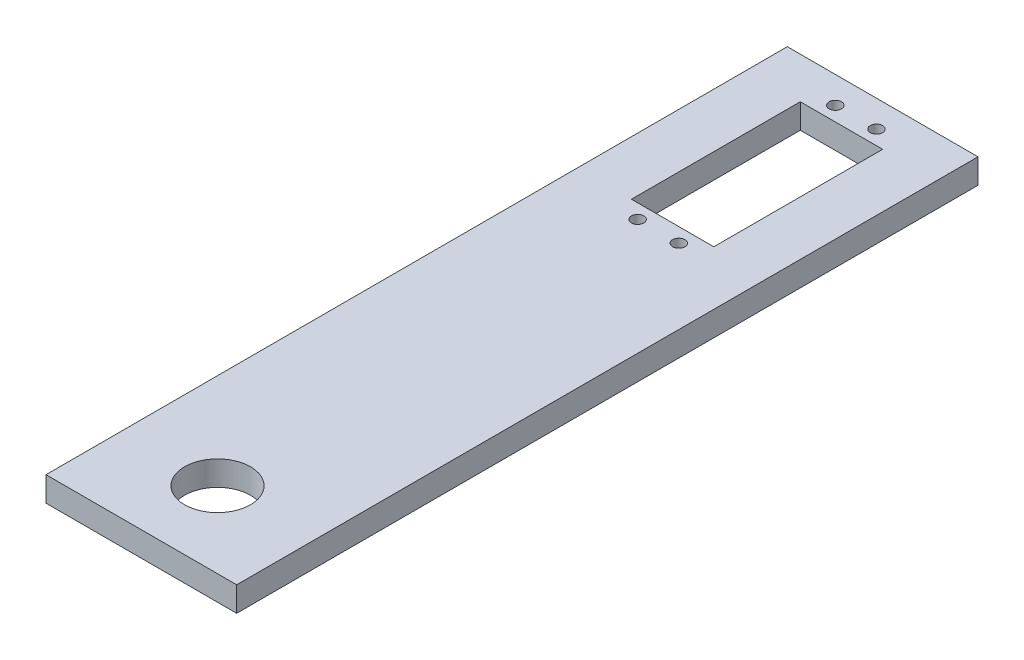
ISO-10303-21;
HEADER;
FILE_DESCRIPTION(('STEP AP214'),'2;1');
FILE_NAME('part.step','',(''),(''),'','','');
FILE_SCHEMA(('AUTOMOTIVE_DESIGN { 1 0 10303 214 1 1 1 1 }'));
ENDSEC;
DATA;
#1=APPLICATION_CONTEXT('core data for automotive mechanical design processes');
#2=APPLICATION_PROTOCOL_DEFINITION('international standard','automotive_design',2000,#1);
#3=PRODUCT_CONTEXT('',#1,'mechanical');
#4=PRODUCT('Part','Part','',(#3));
#5=PRODUCT_RELATED_PRODUCT_CATEGORY('part','',(#4));
#6=PRODUCT_DEFINITION_FORMATION('','',#4);
#7=PRODUCT_DEFINITION_CONTEXT('part definition',#1,'design');
#8=PRODUCT_DEFINITION('design','',#6,#7);
#9=PRODUCT_DEFINITION_SHAPE('','',#8);
#10=(LENGTH_UNIT() NAMED_UNIT(*) SI_UNIT(.MILLI.,.METRE.));
#11=(NAMED_UNIT(*) PLANE_ANGLE_UNIT() SI_UNIT($,.RADIAN.));
#12=(NAMED_UNIT(*) SI_UNIT($,.STERADIAN.) SOLID_ANGLE_UNIT());
#13=UNCERTAINTY_MEASURE_WITH_UNIT(LENGTH_MEASURE(1.E-05),#10,'distance_accuracy_value','');
#14=(GEOMETRIC_REPRESENTATION_CONTEXT(3) GLOBAL_UNCERTAINTY_ASSIGNED_CONTEXT((#13)) GLOBAL_UNIT_ASSIGNED_CONTEXT((#10,
#11,#12)) REPRESENTATION_CONTEXT('',''));
#15=CARTESIAN_POINT('',(0.,0.,0.));
#16=DIRECTION('',(0.,0.,1.));
#17=DIRECTION('',(1.,0.,0.));
#18=AXIS2_PLACEMENT_3D('',#15,#16,#17);
#19=CARTESIAN_POINT('',(0.,6.,0.));
#20=DIRECTION('',(1.,0.,0.));
#21=DIRECTION('',(0.,0.,-1.));
#22=AXIS2_PLACEMENT_3D('',#19,#20,#21);
#23=PLANE('',#22);
#24=DIRECTION('',(0.,0.,1.));
#25=VECTOR('',#24,1.);
#26=CARTESIAN_POINT('',(0.,0.,0.));
#27=LINE('',#26,#25);
#28=CARTESIAN_POINT('',(0.,0.,-180.));
#29=VERTEX_POINT('',#28);
#30=CARTESIAN_POINT('',(0.,0.,0.));
#31=VERTEX_POINT('',#30);
#32=EDGE_CURVE('E160',#29,#31,#27,.T.);
#33=ORIENTED_EDGE('',*,*,#32,.T.);
#34=DIRECTION('',(0.,-1.,0.));
#35=VECTOR('',#34,1.);
#36=CARTESIAN_POINT('',(0.,6.,0.));
#37=LINE('',#36,#35);
#38=CARTESIAN_POINT('',(0.,6.,0.));
#39=VERTEX_POINT('',#38);
#40=EDGE_CURVE('E11',#39,#31,#37,.T.);
#41=ORIENTED_EDGE('',*,*,#40,.F.);
#42=DIRECTION('',(0.,0.,1.));
#43=VECTOR('',#42,1.);
#44=CARTESIAN_POINT('',(0.,6.,0.));
#45=LINE('',#44,#43);
#46=CARTESIAN_POINT('',(0.,6.,-180.));
#47=VERTEX_POINT('',#46);
#48=EDGE_CURVE('E164',#47,#39,#45,.T.);
#49=ORIENTED_EDGE('',*,*,#48,.F.);
#50=DIRECTION('',(0.,-1.,0.));
#51=VECTOR('',#50,1.);
#52=CARTESIAN_POINT('',(0.,6.,-180.));
#53=LINE('',#52,#51);
#54=EDGE_CURVE('E178',#47,#29,#53,.T.);
#55=ORIENTED_EDGE('',*,*,#54,.T.);
#56=EDGE_LOOP('',(#33,#41,#49,#55));
#57=FACE_BOUND('',#56,.T.);
#58=ADVANCED_FACE('F43',(#57),#23,.F.);
#59=CARTESIAN_POINT('',(0.,6.,0.));
#60=DIRECTION('',(0.,0.,-1.));
#61=DIRECTION('',(-1.,0.,0.));
#62=AXIS2_PLACEMENT_3D('',#59,#60,#61);
#63=PLANE('',#62);
#64=DIRECTION('',(1.,0.,0.));
#65=VECTOR('',#64,1.);
#66=CARTESIAN_POINT('',(0.,0.,0.));
#67=LINE('',#66,#65);
#68=CARTESIAN_POINT('',(46.3,0.,0.));
#69=VERTEX_POINT('',#68);
#70=EDGE_CURVE('E182',#31,#69,#67,.T.);
#71=ORIENTED_EDGE('',*,*,#70,.T.);
#72=DIRECTION('',(0.,-1.,0.));
#73=VECTOR('',#72,1.);
#74=CARTESIAN_POINT('',(46.3,6.,0.));
#75=LINE('',#74,#73);
#76=CARTESIAN_POINT('',(46.3,6.,0.));
#77=VERTEX_POINT('',#76);
#78=EDGE_CURVE('E51',#77,#69,#75,.T.);
#79=ORIENTED_EDGE('',*,*,#78,.F.);
#80=DIRECTION('',(1.,0.,0.));
#81=VECTOR('',#80,1.);
#82=CARTESIAN_POINT('',(0.,6.,0.));
#83=LINE('',#82,#81);
#84=EDGE_CURVE('E168',#39,#77,#83,.T.);
#85=ORIENTED_EDGE('',*,*,#84,.F.);
#86=ORIENTED_EDGE('',*,*,#40,.T.);
#87=EDGE_LOOP('',(#71,#79,#85,#86));
#88=FACE_BOUND('',#87,.T.);
#89=ADVANCED_FACE('F217',(#88),#63,.F.);
#90=CARTESIAN_POINT('',(46.3,6.,0.));
#91=DIRECTION('',(-1.,0.,0.));
#92=DIRECTION('',(0.,0.,1.));
#93=AXIS2_PLACEMENT_3D('',#90,#91,#92);
#94=PLANE('',#93);
#95=DIRECTION('',(0.,0.,-1.));
#96=VECTOR('',#95,1.);
#97=CARTESIAN_POINT('',(46.3,0.,0.));
#98=LINE('',#97,#96);
#99=CARTESIAN_POINT('',(46.3,0.,-180.));
#100=VERTEX_POINT('',#99);
#101=EDGE_CURVE('E185',#69,#100,#98,.T.);
#102=ORIENTED_EDGE('',*,*,#101,.T.);
#103=DIRECTION('',(0.,-1.,0.));
#104=VECTOR('',#103,1.);
#105=CARTESIAN_POINT('',(46.3,6.,-180.));
#106=LINE('',#105,#104);
#107=CARTESIAN_POINT('',(46.3,6.,-180.));
#108=VERTEX_POINT('',#107);
#109=EDGE_CURVE('E193',#108,#100,#106,.T.);
#110=ORIENTED_EDGE('',*,*,#109,.F.);
#111=DIRECTION('',(0.,0.,-1.));
#112=VECTOR('',#111,1.);
#113=CARTESIAN_POINT('',(46.3,6.,0.));
#114=LINE('',#113,#112);
#115=EDGE_CURVE('E172',#77,#108,#114,.T.);
#116=ORIENTED_EDGE('',*,*,#115,.F.);
#117=ORIENTED_EDGE('',*,*,#78,.T.);
#118=EDGE_LOOP('',(#102,#110,#116,#117));
#119=FACE_BOUND('',#118,.T.);
#120=ADVANCED_FACE('F202',(#119),#94,.F.);
#121=CARTESIAN_POINT('',(0.,6.,-180.));
#122=DIRECTION('',(0.,0.,1.));
#123=DIRECTION('',(1.,0.,0.));
#124=AXIS2_PLACEMENT_3D('',#121,#122,#123);
#125=PLANE('',#124);
#126=DIRECTION('',(-1.,0.,0.));
#127=VECTOR('',#126,1.);
#128=CARTESIAN_POINT('',(0.,0.,-180.));
#129=LINE('',#128,#127);
#130=EDGE_CURVE('E169',#100,#29,#129,.T.);
#131=ORIENTED_EDGE('',*,*,#130,.T.);
#132=ORIENTED_EDGE('',*,*,#54,.F.);
#133=DIRECTION('',(-1.,0.,0.));
#134=VECTOR('',#133,1.);
#135=CARTESIAN_POINT('',(0.,6.,-180.));
#136=LINE('',#135,#134);
#137=EDGE_CURVE('E175',#108,#47,#136,.T.);
#138=ORIENTED_EDGE('',*,*,#137,.F.);
#139=ORIENTED_EDGE('',*,*,#109,.T.);
#140=EDGE_LOOP('',(#131,#132,#138,#139));
#141=FACE_BOUND('',#140,.T.);
#142=ADVANCED_FACE('F211',(#141),#125,.F.);
#143=CARTESIAN_POINT('',(0.,6.,0.));
#144=DIRECTION('',(0.,-1.,0.));
#145=DIRECTION('',(0.,0.,-1.));
#146=AXIS2_PLACEMENT_3D('',#143,#144,#145);
#147=PLANE('',#146);
#148=CARTESIAN_POINT('',(28.15,6.,-125.5));
#149=DIRECTION('',(0.,-1.,0.));
#150=DIRECTION('',(0.,0.,-1.));
#151=AXIS2_PLACEMENT_3D('',#148,#149,#150);
#152=CIRCLE('',#151,1.50000000000001);
#153=CARTESIAN_POINT('',(28.15,6.,-127.));
#154=VERTEX_POINT('',#153);
#155=EDGE_CURVE('E295',#154,#154,#152,.F.);
#156=ORIENTED_EDGE('',*,*,#155,.F.);
#157=EDGE_LOOP('',(#156));
#158=FACE_BOUND('',#157,.T.);
#159=CARTESIAN_POINT('',(18.15,6.,-125.5));
#160=DIRECTION('',(0.,-1.,0.));
#161=DIRECTION('',(0.,0.,-1.));
#162=AXIS2_PLACEMENT_3D('',#159,#160,#161);
#163=CIRCLE('',#162,1.50000000000001);
#164=CARTESIAN_POINT('',(18.15,6.,-127.));
#165=VERTEX_POINT('',#164);
#166=EDGE_CURVE('E287',#165,#165,#163,.F.);
#167=ORIENTED_EDGE('',*,*,#166,.F.);
#168=EDGE_LOOP('',(#167));
#169=FACE_BOUND('',#168,.T.);
#170=CARTESIAN_POINT('',(18.15,6.,-173.5));
#171=DIRECTION('',(0.,-1.,0.));
#172=DIRECTION('',(0.,0.,-1.));
#173=AXIS2_PLACEMENT_3D('',#170,#171,#172);
#174=CIRCLE('',#173,1.50000000000001);
#175=CARTESIAN_POINT('',(18.15,6.,-175.));
#176=VERTEX_POINT('',#175);
#177=EDGE_CURVE('E280',#176,#176,#174,.F.);
#178=ORIENTED_EDGE('',*,*,#177,.F.);
#179=EDGE_LOOP('',(#178));
#180=FACE_BOUND('',#179,.T.);
#181=CARTESIAN_POINT('',(28.15,6.,-173.5));
#182=DIRECTION('',(0.,-1.,0.));
#183=DIRECTION('',(0.,0.,-1.));
#184=AXIS2_PLACEMENT_3D('',#181,#182,#183);
#185=CIRCLE('',#184,1.50000000000001);
#186=CARTESIAN_POINT('',(28.15,6.,-175.));
#187=VERTEX_POINT('',#186);
#188=EDGE_CURVE('E271',#187,#187,#185,.F.);
#189=ORIENTED_EDGE('',*,*,#188,.F.);
#190=EDGE_LOOP('',(#189));
#191=FACE_BOUND('',#190,.T.);
#192=DIRECTION('',(1.,0.,0.));
#193=VECTOR('',#192,1.);
#194=CARTESIAN_POINT('',(13.15,6.,-129.));
#195=LINE('',#194,#193);
#196=CARTESIAN_POINT('',(13.15,6.,-129.));
#197=VERTEX_POINT('',#196);
#198=CARTESIAN_POINT('',(33.15,6.,-129.));
#199=VERTEX_POINT('',#198);
#200=EDGE_CURVE('E130',#197,#199,#195,.T.);
#201=ORIENTED_EDGE('',*,*,#200,.F.);
#202=DIRECTION('',(0.,0.,1.));
#203=VECTOR('',#202,1.);
#204=CARTESIAN_POINT('',(13.15,6.,-129.));
#205=LINE('',#204,#203);
#206=CARTESIAN_POINT('',(13.15,6.,-170.));
#207=VERTEX_POINT('',#206);
#208=EDGE_CURVE('E110',#207,#197,#205,.T.);
#209=ORIENTED_EDGE('',*,*,#208,.F.);
#210=DIRECTION('',(-1.,0.,0.));
#211=VECTOR('',#210,1.);
#212=CARTESIAN_POINT('',(13.15,6.,-170.));
#213=LINE('',#212,#211);
#214=CARTESIAN_POINT('',(33.15,6.,-170.));
#215=VERTEX_POINT('',#214);
#216=EDGE_CURVE('E120',#215,#207,#213,.T.);
#217=ORIENTED_EDGE('',*,*,#216,.F.);
#218=DIRECTION('',(0.,0.,-1.));
#219=VECTOR('',#218,1.);
#220=CARTESIAN_POINT('',(33.15,6.,-129.));
#221=LINE('',#220,#219);
#222=EDGE_CURVE('E58',#199,#215,#221,.T.);
#223=ORIENTED_EDGE('',*,*,#222,.F.);
#224=EDGE_LOOP('',(#201,#209,#217,#223));
#225=FACE_BOUND('',#224,.T.);
#226=CARTESIAN_POINT('',(23.15,6.,-18.5));
#227=DIRECTION('',(0.,1.,0.));
#228=DIRECTION('',(0.,0.,1.));
#229=AXIS2_PLACEMENT_3D('',#226,#227,#228);
#230=CIRCLE('',#229,8.);
#231=CARTESIAN_POINT('',(23.15,6.,-10.5));
#232=VERTEX_POINT('',#231);
#233=EDGE_CURVE('E156',#232,#232,#230,.T.);
#234=ORIENTED_EDGE('',*,*,#233,.F.);
#235=EDGE_LOOP('',(#234));
#236=FACE_BOUND('',#235,.T.);
#237=ORIENTED_EDGE('',*,*,#48,.T.);
#238=ORIENTED_EDGE('',*,*,#84,.T.);
#239=ORIENTED_EDGE('',*,*,#115,.T.);
#240=ORIENTED_EDGE('',*,*,#137,.T.);
#241=EDGE_LOOP('',(#237,#238,#239,#240));
#242=FACE_BOUND('',#241,.T.);
#243=ADVANCED_FACE('F127',(#158,#169,#180,#191,#225,#236,#242),#147,.F.);
#244=CARTESIAN_POINT('',(0.,0.,0.));
#245=DIRECTION('',(0.,-1.,0.));
#246=DIRECTION('',(0.,0.,-1.));
#247=AXIS2_PLACEMENT_3D('',#244,#245,#246);
#248=PLANE('',#247);
#249=CARTESIAN_POINT('',(28.15,0.,-125.5));
#250=DIRECTION('',(0.,-1.,0.));
#251=DIRECTION('',(0.,0.,1.));
#252=AXIS2_PLACEMENT_3D('',#249,#250,#251);
#253=CIRCLE('',#252,1.50000000000001);
#254=CARTESIAN_POINT('',(28.15,0.,-127.));
#255=VERTEX_POINT('',#254);
#256=EDGE_CURVE('E291',#255,#255,#253,.T.);
#257=ORIENTED_EDGE('',*,*,#256,.F.);
#258=EDGE_LOOP('',(#257));
#259=FACE_BOUND('',#258,.T.);
#260=CARTESIAN_POINT('',(18.15,0.,-125.5));
#261=DIRECTION('',(0.,-1.,0.));
#262=DIRECTION('',(0.,0.,-1.));
#263=AXIS2_PLACEMENT_3D('',#260,#261,#262);
#264=CIRCLE('',#263,1.50000000000001);
#265=CARTESIAN_POINT('',(18.15,0.,-127.));
#266=VERTEX_POINT('',#265);
#267=EDGE_CURVE('E285',#266,#266,#264,.T.);
#268=ORIENTED_EDGE('',*,*,#267,.F.);
#269=EDGE_LOOP('',(#268));
#270=FACE_BOUND('',#269,.T.);
#271=CARTESIAN_POINT('',(18.15,0.,-173.5));
#272=DIRECTION('',(0.,-1.,0.));
#273=DIRECTION('',(0.,0.,1.));
#274=AXIS2_PLACEMENT_3D('',#271,#272,#273);
#275=CIRCLE('',#274,1.50000000000001);
#276=CARTESIAN_POINT('',(18.15,0.,-175.));
#277=VERTEX_POINT('',#276);
#278=EDGE_CURVE('E274',#277,#277,#275,.T.);
#279=ORIENTED_EDGE('',*,*,#278,.F.);
#280=EDGE_LOOP('',(#279));
#281=FACE_BOUND('',#280,.T.);
#282=CARTESIAN_POINT('',(28.15,0.,-173.5));
#283=DIRECTION('',(0.,-1.,0.));
#284=DIRECTION('',(0.,0.,-1.));
#285=AXIS2_PLACEMENT_3D('',#282,#283,#284);
#286=CIRCLE('',#285,1.50000000000001);
#287=CARTESIAN_POINT('',(28.15,0.,-175.));
#288=VERTEX_POINT('',#287);
#289=EDGE_CURVE('E268',#288,#288,#286,.T.);
#290=ORIENTED_EDGE('',*,*,#289,.F.);
#291=EDGE_LOOP('',(#290));
#292=FACE_BOUND('',#291,.T.);
#293=DIRECTION('',(0.,0.,-1.));
#294=VECTOR('',#293,1.);
#295=CARTESIAN_POINT('',(13.15,0.,-129.));
#296=LINE('',#295,#294);
#297=CARTESIAN_POINT('',(13.15,0.,-129.));
#298=VERTEX_POINT('',#297);
#299=CARTESIAN_POINT('',(13.15,0.,-170.));
#300=VERTEX_POINT('',#299);
#301=EDGE_CURVE('E66',#298,#300,#296,.T.);
#302=ORIENTED_EDGE('',*,*,#301,.F.);
#303=DIRECTION('',(-1.,0.,0.));
#304=VECTOR('',#303,1.);
#305=CARTESIAN_POINT('',(13.15,0.,-129.));
#306=LINE('',#305,#304);
#307=CARTESIAN_POINT('',(33.15,0.,-129.));
#308=VERTEX_POINT('',#307);
#309=EDGE_CURVE('E117',#308,#298,#306,.T.);
#310=ORIENTED_EDGE('',*,*,#309,.F.);
#311=DIRECTION('',(0.,0.,1.));
#312=VECTOR('',#311,1.);
#313=CARTESIAN_POINT('',(33.15,0.,-129.));
#314=LINE('',#313,#312);
#315=CARTESIAN_POINT('',(33.15,0.,-170.));
#316=VERTEX_POINT('',#315);
#317=EDGE_CURVE('E142',#316,#308,#314,.T.);
#318=ORIENTED_EDGE('',*,*,#317,.F.);
#319=DIRECTION('',(1.,0.,0.));
#320=VECTOR('',#319,1.);
#321=CARTESIAN_POINT('',(13.15,0.,-170.));
#322=LINE('',#321,#320);
#323=EDGE_CURVE('E135',#300,#316,#322,.T.);
#324=ORIENTED_EDGE('',*,*,#323,.F.);
#325=EDGE_LOOP('',(#302,#310,#318,#324));
#326=FACE_BOUND('',#325,.T.);
#327=CARTESIAN_POINT('',(23.15,0.,-18.5));
#328=DIRECTION('',(0.,-1.,0.));
#329=DIRECTION('',(0.,0.,-1.));
#330=AXIS2_PLACEMENT_3D('',#327,#328,#329);
#331=CIRCLE('',#330,8.);
#332=CARTESIAN_POINT('',(23.15,0.,-10.5));
#333=VERTEX_POINT('',#332);
#334=EDGE_CURVE('E124',#333,#333,#331,.F.);
#335=ORIENTED_EDGE('',*,*,#334,.T.);
#336=EDGE_LOOP('',(#335));
#337=FACE_BOUND('',#336,.T.);
#338=ORIENTED_EDGE('',*,*,#32,.F.);
#339=ORIENTED_EDGE('',*,*,#130,.F.);
#340=ORIENTED_EDGE('',*,*,#101,.F.);
#341=ORIENTED_EDGE('',*,*,#70,.F.);
#342=EDGE_LOOP('',(#338,#339,#340,#341));
#343=FACE_BOUND('',#342,.T.);
#344=ADVANCED_FACE('F208',(#259,#270,#281,#292,#326,#337,#343),#248,.T.);
#345=CARTESIAN_POINT('',(23.15,-0.00100000000000013,-18.5));
#346=DIRECTION('',(0.,1.,0.));
#347=DIRECTION('',(0.,0.,1.));
#348=AXIS2_PLACEMENT_3D('',#345,#346,#347);
#349=CYLINDRICAL_SURFACE('',#348,8.);
#350=CARTESIAN_POINT('',(23.15,0.,-10.5));
#351=CARTESIAN_POINT('',(23.15,0.0624999999999999,-10.5));
#352=CARTESIAN_POINT('',(23.15,0.125,-10.5));
#353=CARTESIAN_POINT('',(23.15,0.25,-10.5));
#354=CARTESIAN_POINT('',(23.15,0.3125,-10.5));
#355=CARTESIAN_POINT('',(23.15,0.4375,-10.5));
#356=CARTESIAN_POINT('',(23.15,0.5,-10.5));
#357=CARTESIAN_POINT('',(23.15,0.625,-10.5));
#358=CARTESIAN_POINT('',(23.15,0.6875,-10.5));
#359=CARTESIAN_POINT('',(23.15,0.8125,-10.5));
#360=CARTESIAN_POINT('',(23.15,0.875,-10.5));
#361=CARTESIAN_POINT('',(23.15,1.,-10.5));
#362=CARTESIAN_POINT('',(23.15,1.0625,-10.5));
#363=CARTESIAN_POINT('',(23.15,1.1875,-10.5));
#364=CARTESIAN_POINT('',(23.15,1.25,-10.5));
#365=CARTESIAN_POINT('',(23.15,1.375,-10.5));
#366=CARTESIAN_POINT('',(23.15,1.4375,-10.5));
#367=CARTESIAN_POINT('',(23.15,1.5625,-10.5));
#368=CARTESIAN_POINT('',(23.15,1.625,-10.5));
#369=CARTESIAN_POINT('',(23.15,1.75,-10.5));
#370=CARTESIAN_POINT('',(23.15,1.8125,-10.5));
#371=CARTESIAN_POINT('',(23.15,1.9375,-10.5));
#372=CARTESIAN_POINT('',(23.15,2.,-10.5));
#373=CARTESIAN_POINT('',(23.15,2.125,-10.5));
#374=CARTESIAN_POINT('',(23.15,2.1875,-10.5));
#375=CARTESIAN_POINT('',(23.15,2.3125,-10.5));
#376=CARTESIAN_POINT('',(23.15,2.375,-10.5));
#377=CARTESIAN_POINT('',(23.15,2.5,-10.5));
#378=CARTESIAN_POINT('',(23.15,2.5625,-10.5));
#379=CARTESIAN_POINT('',(23.15,2.6875,-10.5));
#380=CARTESIAN_POINT('',(23.15,2.75,-10.5));
#381=CARTESIAN_POINT('',(23.15,2.875,-10.5));
#382=CARTESIAN_POINT('',(23.15,2.9375,-10.5));
#383=CARTESIAN_POINT('',(23.15,3.0625,-10.5));
#384=CARTESIAN_POINT('',(23.15,3.125,-10.5));
#385=CARTESIAN_POINT('',(23.15,3.25,-10.5));
#386=CARTESIAN_POINT('',(23.15,3.3125,-10.5));
#387=CARTESIAN_POINT('',(23.15,3.4375,-10.5));
#388=CARTESIAN_POINT('',(23.15,3.5,-10.5));
#389=CARTESIAN_POINT('',(23.15,3.625,-10.5));
#390=CARTESIAN_POINT('',(23.15,3.6875,-10.5));
#391=CARTESIAN_POINT('',(23.15,3.8125,-10.5));
#392=CARTESIAN_POINT('',(23.15,3.875,-10.5));
#393=CARTESIAN_POINT('',(23.15,4.,-10.5));
#394=CARTESIAN_POINT('',(23.15,4.0625,-10.5));
#395=CARTESIAN_POINT('',(23.15,4.1875,-10.5));
#396=CARTESIAN_POINT('',(23.15,4.25,-10.5));
#397=CARTESIAN_POINT('',(23.15,4.375,-10.5));
#398=CARTESIAN_POINT('',(23.15,4.4375,-10.5));
#399=CARTESIAN_POINT('',(23.15,4.5625,-10.5));
#400=CARTESIAN_POINT('',(23.15,4.625,-10.5));
#401=CARTESIAN_POINT('',(23.15,4.75,-10.5));
#402=CARTESIAN_POINT('',(23.15,4.8125,-10.5));
#403=CARTESIAN_POINT('',(23.15,4.9375,-10.5));
#404=CARTESIAN_POINT('',(23.15,5.,-10.5));
#405=CARTESIAN_POINT('',(23.15,5.125,-10.5));
#406=CARTESIAN_POINT('',(23.15,5.1875,-10.5));
#407=CARTESIAN_POINT('',(23.15,5.3125,-10.5));
#408=CARTESIAN_POINT('',(23.15,5.375,-10.5));
#409=CARTESIAN_POINT('',(23.15,5.5,-10.5));
#410=CARTESIAN_POINT('',(23.15,5.5625,-10.5));
#411=CARTESIAN_POINT('',(23.15,5.6875,-10.5));
#412=CARTESIAN_POINT('',(23.15,5.75,-10.5));
#413=CARTESIAN_POINT('',(23.15,5.875,-10.5));
#414=CARTESIAN_POINT('',(23.15,5.9375,-10.5));
#415=CARTESIAN_POINT('',(23.15,6.,-10.5));
#416=B_SPLINE_CURVE_WITH_KNOTS('',3,(#350,#351,#352,#353,#354,#355,#356,#357,#358,#359,#360,
#361,#362,#363,#364,#365,#366,#367,#368,#369,#370,#371,#372,#373,#374,#375,#376,#377,#378,#379,
#380,#381,#382,#383,#384,#385,#386,#387,#388,#389,#390,#391,#392,#393,#394,#395,#396,#397,#398,
#399,#400,#401,#402,#403,#404,#405,#406,#407,#408,#409,#410,#411,#412,#413,#414,#415),
.UNSPECIFIED.,.F.,.F.,(4,2,2,2,2,2,2,2,2,2,2,2,2,2,2,2,2,2,2,2,2,2,2,2,2,2,2,2,2,2,2,2,4),(0.,
0.1875,0.375,0.5625,0.75,0.9375,1.125,1.3125,1.5,1.6875,1.875,2.0625,2.25,2.4375,2.625,2.8125,
3.,3.1875,3.375,3.5625,3.75,3.9375,4.125,4.3125,4.5,4.6875,4.875,5.0625,5.25,5.4375,5.625,
5.8125,6.),.UNSPECIFIED.);
#417=EDGE_CURVE('BSEAM229',#333,#232,#416,.T.);
#418=ORIENTED_EDGE('',*,*,#334,.F.);
#419=ORIENTED_EDGE('',*,*,#233,.T.);
#420=ORIENTED_EDGE('',*,*,#417,.T.);
#421=ORIENTED_EDGE('',*,*,#417,.F.);
#422=EDGE_LOOP('',(#418,#420,#419,#421));
#423=FACE_BOUND('',#422,.T.);
#424=ADVANCED_FACE('F229',(#423),#349,.F.);
#425=CARTESIAN_POINT('',(13.15,6.001,-129.));
#426=DIRECTION('',(-1.,0.,0.));
#427=DIRECTION('',(0.,0.,1.));
#428=AXIS2_PLACEMENT_3D('',#425,#426,#427);
#429=PLANE('',#428);
#430=ORIENTED_EDGE('',*,*,#208,.T.);
#431=DIRECTION('',(0.,-1.,0.));
#432=VECTOR('',#431,1.);
#433=CARTESIAN_POINT('',(13.15,6.001,-129.));
#434=LINE('',#433,#432);
#435=EDGE_CURVE('E125',#197,#298,#434,.T.);
#436=ORIENTED_EDGE('',*,*,#435,.T.);
#437=ORIENTED_EDGE('',*,*,#301,.T.);
#438=DIRECTION('',(0.,-1.,0.));
#439=VECTOR('',#438,1.);
#440=CARTESIAN_POINT('',(13.15,6.001,-170.));
#441=LINE('',#440,#439);
#442=EDGE_CURVE('E106',#207,#300,#441,.T.);
#443=ORIENTED_EDGE('',*,*,#442,.F.);
#444=EDGE_LOOP('',(#430,#436,#437,#443));
#445=FACE_BOUND('',#444,.T.);
#446=ADVANCED_FACE('F108',(#445),#429,.F.);
#447=CARTESIAN_POINT('',(13.15,6.001,-129.));
#448=DIRECTION('',(0.,0.,1.));
#449=DIRECTION('',(1.,0.,0.));
#450=AXIS2_PLACEMENT_3D('',#447,#448,#449);
#451=PLANE('',#450);
#452=ORIENTED_EDGE('',*,*,#200,.T.);
#453=DIRECTION('',(0.,-1.,0.));
#454=VECTOR('',#453,1.);
#455=CARTESIAN_POINT('',(33.15,6.001,-129.));
#456=LINE('',#455,#454);
#457=EDGE_CURVE('E151',#199,#308,#456,.T.);
#458=ORIENTED_EDGE('',*,*,#457,.T.);
#459=ORIENTED_EDGE('',*,*,#309,.T.);
#460=ORIENTED_EDGE('',*,*,#435,.F.);
#461=EDGE_LOOP('',(#452,#458,#459,#460));
#462=FACE_BOUND('',#461,.T.);
#463=ADVANCED_FACE('F239',(#462),#451,.F.);
#464=CARTESIAN_POINT('',(33.15,6.001,-129.));
#465=DIRECTION('',(1.,0.,0.));
#466=DIRECTION('',(0.,0.,-1.));
#467=AXIS2_PLACEMENT_3D('',#464,#465,#466);
#468=PLANE('',#467);
#469=ORIENTED_EDGE('',*,*,#222,.T.);
#470=DIRECTION('',(0.,-1.,0.));
#471=VECTOR('',#470,1.);
#472=CARTESIAN_POINT('',(33.15,6.001,-170.));
#473=LINE('',#472,#471);
#474=EDGE_CURVE('E116',#215,#316,#473,.T.);
#475=ORIENTED_EDGE('',*,*,#474,.T.);
#476=ORIENTED_EDGE('',*,*,#317,.T.);
#477=ORIENTED_EDGE('',*,*,#457,.F.);
#478=EDGE_LOOP('',(#469,#475,#476,#477));
#479=FACE_BOUND('',#478,.T.);
#480=ADVANCED_FACE('F243',(#479),#468,.F.);
#481=CARTESIAN_POINT('',(13.15,6.001,-170.));
#482=DIRECTION('',(0.,0.,-1.));
#483=DIRECTION('',(-1.,0.,0.));
#484=AXIS2_PLACEMENT_3D('',#481,#482,#483);
#485=PLANE('',#484);
#486=ORIENTED_EDGE('',*,*,#216,.T.);
#487=ORIENTED_EDGE('',*,*,#442,.T.);
#488=ORIENTED_EDGE('',*,*,#323,.T.);
#489=ORIENTED_EDGE('',*,*,#474,.F.);
#490=EDGE_LOOP('',(#486,#487,#488,#489));
#491=FACE_BOUND('',#490,.T.);
#492=ADVANCED_FACE('F121',(#491),#485,.F.);
#493=CARTESIAN_POINT('',(28.15,6.001,-173.5));
#494=DIRECTION('',(0.,-1.,0.));
#495=DIRECTION('',(0.,0.,-1.));
#496=AXIS2_PLACEMENT_3D('',#493,#494,#495);
#497=CYLINDRICAL_SURFACE('',#496,1.50000000000001);
#498=CARTESIAN_POINT('',(28.15,0.,-175.));
#499=CARTESIAN_POINT('',(28.15,0.0625000000000001,-175.));
#500=CARTESIAN_POINT('',(28.15,0.125,-175.));
#501=CARTESIAN_POINT('',(28.15,0.25,-175.));
#502=CARTESIAN_POINT('',(28.15,0.3125,-175.));
#503=CARTESIAN_POINT('',(28.15,0.4375,-175.));
#504=CARTESIAN_POINT('',(28.15,0.5,-175.));
#505=CARTESIAN_POINT('',(28.15,0.625000000000001,-175.));
#506=CARTESIAN_POINT('',(28.15,0.687500000000001,-175.));
#507=CARTESIAN_POINT('',(28.15,0.8125,-175.));
#508=CARTESIAN_POINT('',(28.15,0.875,-175.));
#509=CARTESIAN_POINT('',(28.15,1.,-175.));
#510=CARTESIAN_POINT('',(28.15,1.0625,-175.));
#511=CARTESIAN_POINT('',(28.15,1.1875,-175.));
#512=CARTESIAN_POINT('',(28.15,1.25,-175.));
#513=CARTESIAN_POINT('',(28.15,1.375,-175.));
#514=CARTESIAN_POINT('',(28.15,1.4375,-175.));
#515=CARTESIAN_POINT('',(28.15,1.5625,-175.));
#516=CARTESIAN_POINT('',(28.15,1.625,-175.));
#517=CARTESIAN_POINT('',(28.15,1.75,-175.));
#518=CARTESIAN_POINT('',(28.15,1.8125,-175.));
#519=CARTESIAN_POINT('',(28.15,1.9375,-175.));
#520=CARTESIAN_POINT('',(28.15,2.,-175.));
#521=CARTESIAN_POINT('',(28.15,2.125,-175.));
#522=CARTESIAN_POINT('',(28.15,2.1875,-175.));
#523=CARTESIAN_POINT('',(28.15,2.3125,-175.));
#524=CARTESIAN_POINT('',(28.15,2.375,-175.));
#525=CARTESIAN_POINT('',(28.15,2.5,-175.));
#526=CARTESIAN_POINT('',(28.15,2.5625,-175.));
#527=CARTESIAN_POINT('',(28.15,2.6875,-175.));
#528=CARTESIAN_POINT('',(28.15,2.75,-175.));
#529=CARTESIAN_POINT('',(28.15,2.875,-175.));
#530=CARTESIAN_POINT('',(28.15,2.9375,-175.));
#531=CARTESIAN_POINT('',(28.15,3.0625,-175.));
#532=CARTESIAN_POINT('',(28.15,3.125,-175.));
#533=CARTESIAN_POINT('',(28.15,3.25,-175.));
#534=CARTESIAN_POINT('',(28.15,3.3125,-175.));
#535=CARTESIAN_POINT('',(28.15,3.4375,-175.));
#536=CARTESIAN_POINT('',(28.15,3.5,-175.));
#537=CARTESIAN_POINT('',(28.15,3.625,-175.));
#538=CARTESIAN_POINT('',(28.15,3.6875,-175.));
#539=CARTESIAN_POINT('',(28.15,3.8125,-175.));
#540=CARTESIAN_POINT('',(28.15,3.875,-175.));
#541=CARTESIAN_POINT('',(28.15,4.,-175.));
#542=CARTESIAN_POINT('',(28.15,4.0625,-175.));
#543=CARTESIAN_POINT('',(28.15,4.1875,-175.));
#544=CARTESIAN_POINT('',(28.15,4.25,-175.));
#545=CARTESIAN_POINT('',(28.15,4.375,-175.));
#546=CARTESIAN_POINT('',(28.15,4.4375,-175.));
#547=CARTESIAN_POINT('',(28.15,4.5625,-175.));
#548=CARTESIAN_POINT('',(28.15,4.625,-175.));
#549=CARTESIAN_POINT('',(28.15,4.75,-175.));
#550=CARTESIAN_POINT('',(28.15,4.8125,-175.));
#551=CARTESIAN_POINT('',(28.15,4.9375,-175.));
#552=CARTESIAN_POINT('',(28.15,5.,-175.));
#553=CARTESIAN_POINT('',(28.15,5.125,-175.));
#554=CARTESIAN_POINT('',(28.15,5.1875,-175.));
#555=CARTESIAN_POINT('',(28.15,5.3125,-175.));
#556=CARTESIAN_POINT('',(28.15,5.375,-175.));
#557=CARTESIAN_POINT('',(28.15,5.5,-175.));
#558=CARTESIAN_POINT('',(28.15,5.5625,-175.));
#559=CARTESIAN_POINT('',(28.15,5.6875,-175.));
#560=CARTESIAN_POINT('',(28.15,5.75,-175.));
#561=CARTESIAN_POINT('',(28.15,5.875,-175.));
#562=CARTESIAN_POINT('',(28.15,5.9375,-175.));
#563=CARTESIAN_POINT('',(28.15,6.,-175.));
#564=B_SPLINE_CURVE_WITH_KNOTS('',3,(#498,#499,#500,#501,#502,#503,#504,#505,#506,#507,#508,
#509,#510,#511,#512,#513,#514,#515,#516,#517,#518,#519,#520,#521,#522,#523,#524,#525,#526,#527,
#528,#529,#530,#531,#532,#533,#534,#535,#536,#537,#538,#539,#540,#541,#542,#543,#544,#545,#546,
#547,#548,#549,#550,#551,#552,#553,#554,#555,#556,#557,#558,#559,#560,#561,#562,#563),
.UNSPECIFIED.,.F.,.F.,(4,2,2,2,2,2,2,2,2,2,2,2,2,2,2,2,2,2,2,2,2,2,2,2,2,2,2,2,2,2,2,2,4),(0.,
0.1875,0.375,0.5625,0.750000000000001,0.9375,1.125,1.3125,1.5,1.6875,1.875,2.0625,2.25,2.4375,
2.625,2.8125,3.,3.1875,3.375,3.5625,3.75,3.9375,4.125,4.3125,4.5,4.6875,4.875,5.0625,5.25,
5.4375,5.625,5.8125,6.),.UNSPECIFIED.);
#565=EDGE_CURVE('BSEAM242',#288,#187,#564,.T.);
#566=ORIENTED_EDGE('',*,*,#289,.T.);
#567=ORIENTED_EDGE('',*,*,#188,.T.);
#568=ORIENTED_EDGE('',*,*,#565,.T.);
#569=ORIENTED_EDGE('',*,*,#565,.F.);
#570=EDGE_LOOP('',(#566,#568,#567,#569));
#571=FACE_BOUND('',#570,.T.);
#572=ADVANCED_FACE('F242',(#571),#497,.F.);
#573=CARTESIAN_POINT('',(18.15,6.001,-173.5));
#574=DIRECTION('',(0.,-1.,0.));
#575=DIRECTION('',(0.,0.,-1.));
#576=AXIS2_PLACEMENT_3D('',#573,#574,#575);
#577=CYLINDRICAL_SURFACE('',#576,1.50000000000001);
#578=CARTESIAN_POINT('',(18.15,0.,-175.));
#579=CARTESIAN_POINT('',(18.15,0.0625000000000001,-175.));
#580=CARTESIAN_POINT('',(18.15,0.125,-175.));
#581=CARTESIAN_POINT('',(18.15,0.25,-175.));
#582=CARTESIAN_POINT('',(18.15,0.3125,-175.));
#583=CARTESIAN_POINT('',(18.15,0.4375,-175.));
#584=CARTESIAN_POINT('',(18.15,0.5,-175.));
#585=CARTESIAN_POINT('',(18.15,0.625000000000001,-175.));
#586=CARTESIAN_POINT('',(18.15,0.687500000000001,-175.));
#587=CARTESIAN_POINT('',(18.15,0.8125,-175.));
#588=CARTESIAN_POINT('',(18.15,0.875,-175.));
#589=CARTESIAN_POINT('',(18.15,1.,-175.));
#590=CARTESIAN_POINT('',(18.15,1.0625,-175.));
#591=CARTESIAN_POINT('',(18.15,1.1875,-175.));
#592=CARTESIAN_POINT('',(18.15,1.25,-175.));
#593=CARTESIAN_POINT('',(18.15,1.375,-175.));
#594=CARTESIAN_POINT('',(18.15,1.4375,-175.));
#595=CARTESIAN_POINT('',(18.15,1.5625,-175.));
#596=CARTESIAN_POINT('',(18.15,1.625,-175.));
#597=CARTESIAN_POINT('',(18.15,1.75,-175.));
#598=CARTESIAN_POINT('',(18.15,1.8125,-175.));
#599=CARTESIAN_POINT('',(18.15,1.9375,-175.));
#600=CARTESIAN_POINT('',(18.15,2.,-175.));
#601=CARTESIAN_POINT('',(18.15,2.125,-175.));
#602=CARTESIAN_POINT('',(18.15,2.1875,-175.));
#603=CARTESIAN_POINT('',(18.15,2.3125,-175.));
#604=CARTESIAN_POINT('',(18.15,2.375,-175.));
#605=CARTESIAN_POINT('',(18.15,2.5,-175.));
#606=CARTESIAN_POINT('',(18.15,2.5625,-175.));
#607=CARTESIAN_POINT('',(18.15,2.6875,-175.));
#608=CARTESIAN_POINT('',(18.15,2.75,-175.));
#609=CARTESIAN_POINT('',(18.15,2.875,-175.));
#610=CARTESIAN_POINT('',(18.15,2.9375,-175.));
#611=CARTESIAN_POINT('',(18.15,3.0625,-175.));
#612=CARTESIAN_POINT('',(18.15,3.125,-175.));
#613=CARTESIAN_POINT('',(18.15,3.25,-175.));
#614=CARTESIAN_POINT('',(18.15,3.3125,-175.));
#615=CARTESIAN_POINT('',(18.15,3.4375,-175.));
#616=CARTESIAN_POINT('',(18.15,3.5,-175.));
#617=CARTESIAN_POINT('',(18.15,3.625,-175.));
#618=CARTESIAN_POINT('',(18.15,3.6875,-175.));
#619=CARTESIAN_POINT('',(18.15,3.8125,-175.));
#620=CARTESIAN_POINT('',(18.15,3.875,-175.));
#621=CARTESIAN_POINT('',(18.15,4.,-175.));
#622=CARTESIAN_POINT('',(18.15,4.0625,-175.));
#623=CARTESIAN_POINT('',(18.15,4.1875,-175.));
#624=CARTESIAN_POINT('',(18.15,4.25,-175.));
#625=CARTESIAN_POINT('',(18.15,4.375,-175.));
#626=CARTESIAN_POINT('',(18.15,4.4375,-175.));
#627=CARTESIAN_POINT('',(18.15,4.5625,-175.));
#628=CARTESIAN_POINT('',(18.15,4.625,-175.));
#629=CARTESIAN_POINT('',(18.15,4.75,-175.));
#630=CARTESIAN_POINT('',(18.15,4.8125,-175.));
#631=CARTESIAN_POINT('',(18.15,4.9375,-175.));
#632=CARTESIAN_POINT('',(18.15,5.,-175.));
#633=CARTESIAN_POINT('',(18.15,5.125,-175.));
#634=CARTESIAN_POINT('',(18.15,5.1875,-175.));
#635=CARTESIAN_POINT('',(18.15,5.3125,-175.));
#636=CARTESIAN_POINT('',(18.15,5.375,-175.));
#637=CARTESIAN_POINT('',(18.15,5.5,-175.));
#638=CARTESIAN_POINT('',(18.15,5.5625,-175.));
#639=CARTESIAN_POINT('',(18.15,5.6875,-175.));
#640=CARTESIAN_POINT('',(18.15,5.75,-175.));
#641=CARTESIAN_POINT('',(18.15,5.875,-175.));
#642=CARTESIAN_POINT('',(18.15,5.9375,-175.));
#643=CARTESIAN_POINT('',(18.15,6.,-175.));
#644=B_SPLINE_CURVE_WITH_KNOTS('',3,(#578,#579,#580,#581,#582,#583,#584,#585,#586,#587,#588,
#589,#590,#591,#592,#593,#594,#595,#596,#597,#598,#599,#600,#601,#602,#603,#604,#605,#606,#607,
#608,#609,#610,#611,#612,#613,#614,#615,#616,#617,#618,#619,#620,#621,#622,#623,#624,#625,#626,
#627,#628,#629,#630,#631,#632,#633,#634,#635,#636,#637,#638,#639,#640,#641,#642,#643),
.UNSPECIFIED.,.F.,.F.,(4,2,2,2,2,2,2,2,2,2,2,2,2,2,2,2,2,2,2,2,2,2,2,2,2,2,2,2,2,2,2,2,4),(0.,
0.1875,0.375,0.5625,0.750000000000001,0.9375,1.125,1.3125,1.5,1.6875,1.875,2.0625,2.25,2.4375,
2.625,2.8125,3.,3.1875,3.375,3.5625,3.75,3.9375,4.125,4.3125,4.5,4.6875,4.875,5.0625,5.25,
5.4375,5.625,5.8125,6.),.UNSPECIFIED.);
#645=EDGE_CURVE('BSEAM256',#277,#176,#644,.T.);
#646=ORIENTED_EDGE('',*,*,#278,.T.);
#647=ORIENTED_EDGE('',*,*,#177,.T.);
#648=ORIENTED_EDGE('',*,*,#645,.T.);
#649=ORIENTED_EDGE('',*,*,#645,.F.);
#650=EDGE_LOOP('',(#646,#648,#647,#649));
#651=FACE_BOUND('',#650,.T.);
#652=ADVANCED_FACE('F256',(#651),#577,.F.);
#653=CARTESIAN_POINT('',(18.15,6.001,-125.5));
#654=DIRECTION('',(0.,-1.,0.));
#655=DIRECTION('',(0.,0.,-1.));
#656=AXIS2_PLACEMENT_3D('',#653,#654,#655);
#657=CYLINDRICAL_SURFACE('',#656,1.50000000000001);
#658=CARTESIAN_POINT('',(18.15,0.,-127.));
#659=CARTESIAN_POINT('',(18.15,0.0625000000000001,-127.));
#660=CARTESIAN_POINT('',(18.15,0.125,-127.));
#661=CARTESIAN_POINT('',(18.15,0.25,-127.));
#662=CARTESIAN_POINT('',(18.15,0.3125,-127.));
#663=CARTESIAN_POINT('',(18.15,0.4375,-127.));
#664=CARTESIAN_POINT('',(18.15,0.5,-127.));
#665=CARTESIAN_POINT('',(18.15,0.625000000000001,-127.));
#666=CARTESIAN_POINT('',(18.15,0.687500000000001,-127.));
#667=CARTESIAN_POINT('',(18.15,0.8125,-127.));
#668=CARTESIAN_POINT('',(18.15,0.875,-127.));
#669=CARTESIAN_POINT('',(18.15,1.,-127.));
#670=CARTESIAN_POINT('',(18.15,1.0625,-127.));
#671=CARTESIAN_POINT('',(18.15,1.1875,-127.));
#672=CARTESIAN_POINT('',(18.15,1.25,-127.));
#673=CARTESIAN_POINT('',(18.15,1.375,-127.));
#674=CARTESIAN_POINT('',(18.15,1.4375,-127.));
#675=CARTESIAN_POINT('',(18.15,1.5625,-127.));
#676=CARTESIAN_POINT('',(18.15,1.625,-127.));
#677=CARTESIAN_POINT('',(18.15,1.75,-127.));
#678=CARTESIAN_POINT('',(18.15,1.8125,-127.));
#679=CARTESIAN_POINT('',(18.15,1.9375,-127.));
#680=CARTESIAN_POINT('',(18.15,2.,-127.));
#681=CARTESIAN_POINT('',(18.15,2.125,-127.));
#682=CARTESIAN_POINT('',(18.15,2.1875,-127.));
#683=CARTESIAN_POINT('',(18.15,2.3125,-127.));
#684=CARTESIAN_POINT('',(18.15,2.375,-127.));
#685=CARTESIAN_POINT('',(18.15,2.5,-127.));
#686=CARTESIAN_POINT('',(18.15,2.5625,-127.));
#687=CARTESIAN_POINT('',(18.15,2.6875,-127.));
#688=CARTESIAN_POINT('',(18.15,2.75,-127.));
#689=CARTESIAN_POINT('',(18.15,2.875,-127.));
#690=CARTESIAN_POINT('',(18.15,2.9375,-127.));
#691=CARTESIAN_POINT('',(18.15,3.0625,-127.));
#692=CARTESIAN_POINT('',(18.15,3.125,-127.));
#693=CARTESIAN_POINT('',(18.15,3.25,-127.));
#694=CARTESIAN_POINT('',(18.15,3.3125,-127.));
#695=CARTESIAN_POINT('',(18.15,3.4375,-127.));
#696=CARTESIAN_POINT('',(18.15,3.5,-127.));
#697=CARTESIAN_POINT('',(18.15,3.625,-127.));
#698=CARTESIAN_POINT('',(18.15,3.6875,-127.));
#699=CARTESIAN_POINT('',(18.15,3.8125,-127.));
#700=CARTESIAN_POINT('',(18.15,3.875,-127.));
#701=CARTESIAN_POINT('',(18.15,4.,-127.));
#702=CARTESIAN_POINT('',(18.15,4.0625,-127.));
#703=CARTESIAN_POINT('',(18.15,4.1875,-127.));
#704=CARTESIAN_POINT('',(18.15,4.25,-127.));
#705=CARTESIAN_POINT('',(18.15,4.375,-127.));
#706=CARTESIAN_POINT('',(18.15,4.4375,-127.));
#707=CARTESIAN_POINT('',(18.15,4.5625,-127.));
#708=CARTESIAN_POINT('',(18.15,4.625,-127.));
#709=CARTESIAN_POINT('',(18.15,4.75,-127.));
#710=CARTESIAN_POINT('',(18.15,4.8125,-127.));
#711=CARTESIAN_POINT('',(18.15,4.9375,-127.));
#712=CARTESIAN_POINT('',(18.15,5.,-127.));
#713=CARTESIAN_POINT('',(18.15,5.125,-127.));
#714=CARTESIAN_POINT('',(18.15,5.1875,-127.));
#715=CARTESIAN_POINT('',(18.15,5.3125,-127.));
#716=CARTESIAN_POINT('',(18.15,5.375,-127.));
#717=CARTESIAN_POINT('',(18.15,5.5,-127.));
#718=CARTESIAN_POINT('',(18.15,5.5625,-127.));
#719=CARTESIAN_POINT('',(18.15,5.6875,-127.));
#720=CARTESIAN_POINT('',(18.15,5.75,-127.));
#721=CARTESIAN_POINT('',(18.15,5.875,-127.));
#722=CARTESIAN_POINT('',(18.15,5.9375,-127.));
#723=CARTESIAN_POINT('',(18.15,6.,-127.));
#724=B_SPLINE_CURVE_WITH_KNOTS('',3,(#658,#659,#660,#661,#662,#663,#664,#665,#666,#667,#668,
#669,#670,#671,#672,#673,#674,#675,#676,#677,#678,#679,#680,#681,#682,#683,#684,#685,#686,#687,
#688,#689,#690,#691,#692,#693,#694,#695,#696,#697,#698,#699,#700,#701,#702,#703,#704,#705,#706,
#707,#708,#709,#710,#711,#712,#713,#714,#715,#716,#717,#718,#719,#720,#721,#722,#723),
.UNSPECIFIED.,.F.,.F.,(4,2,2,2,2,2,2,2,2,2,2,2,2,2,2,2,2,2,2,2,2,2,2,2,2,2,2,2,2,2,2,2,4),(0.,
0.1875,0.375,0.5625,0.750000000000001,0.9375,1.125,1.3125,1.5,1.6875,1.875,2.0625,2.25,2.4375,
2.625,2.8125,3.,3.1875,3.375,3.5625,3.75,3.9375,4.125,4.3125,4.5,4.6875,4.875,5.0625,5.25,
5.4375,5.625,5.8125,6.),.UNSPECIFIED.);
#725=EDGE_CURVE('BSEAM252',#266,#165,#724,.T.);
#726=ORIENTED_EDGE('',*,*,#267,.T.);
#727=ORIENTED_EDGE('',*,*,#166,.T.);
#728=ORIENTED_EDGE('',*,*,#725,.T.);
#729=ORIENTED_EDGE('',*,*,#725,.F.);
#730=EDGE_LOOP('',(#726,#728,#727,#729));
#731=FACE_BOUND('',#730,.T.);
#732=ADVANCED_FACE('F252',(#731),#657,.F.);
#733=CARTESIAN_POINT('',(28.15,6.001,-125.5));
#734=DIRECTION('',(0.,-1.,0.));
#735=DIRECTION('',(0.,0.,-1.));
#736=AXIS2_PLACEMENT_3D('',#733,#734,#735);
#737=CYLINDRICAL_SURFACE('',#736,1.50000000000001);
#738=CARTESIAN_POINT('',(28.15,0.,-127.));
#739=CARTESIAN_POINT('',(28.15,0.0625000000000001,-127.));
#740=CARTESIAN_POINT('',(28.15,0.125,-127.));
#741=CARTESIAN_POINT('',(28.15,0.25,-127.));
#742=CARTESIAN_POINT('',(28.15,0.3125,-127.));
#743=CARTESIAN_POINT('',(28.15,0.4375,-127.));
#744=CARTESIAN_POINT('',(28.15,0.5,-127.));
#745=CARTESIAN_POINT('',(28.15,0.625000000000001,-127.));
#746=CARTESIAN_POINT('',(28.15,0.687500000000001,-127.));
#747=CARTESIAN_POINT('',(28.15,0.8125,-127.));
#748=CARTESIAN_POINT('',(28.15,0.875,-127.));
#749=CARTESIAN_POINT('',(28.15,1.,-127.));
#750=CARTESIAN_POINT('',(28.15,1.0625,-127.));
#751=CARTESIAN_POINT('',(28.15,1.1875,-127.));
#752=CARTESIAN_POINT('',(28.15,1.25,-127.));
#753=CARTESIAN_POINT('',(28.15,1.375,-127.));
#754=CARTESIAN_POINT('',(28.15,1.4375,-127.));
#755=CARTESIAN_POINT('',(28.15,1.5625,-127.));
#756=CARTESIAN_POINT('',(28.15,1.625,-127.));
#757=CARTESIAN_POINT('',(28.15,1.75,-127.));
#758=CARTESIAN_POINT('',(28.15,1.8125,-127.));
#759=CARTESIAN_POINT('',(28.15,1.9375,-127.));
#760=CARTESIAN_POINT('',(28.15,2.,-127.));
#761=CARTESIAN_POINT('',(28.15,2.125,-127.));
#762=CARTESIAN_POINT('',(28.15,2.1875,-127.));
#763=CARTESIAN_POINT('',(28.15,2.3125,-127.));
#764=CARTESIAN_POINT('',(28.15,2.375,-127.));
#765=CARTESIAN_POINT('',(28.15,2.5,-127.));
#766=CARTESIAN_POINT('',(28.15,2.5625,-127.));
#767=CARTESIAN_POINT('',(28.15,2.6875,-127.));
#768=CARTESIAN_POINT('',(28.15,2.75,-127.));
#769=CARTESIAN_POINT('',(28.15,2.875,-127.));
#770=CARTESIAN_POINT('',(28.15,2.9375,-127.));
#771=CARTESIAN_POINT('',(28.15,3.0625,-127.));
#772=CARTESIAN_POINT('',(28.15,3.125,-127.));
#773=CARTESIAN_POINT('',(28.15,3.25,-127.));
#774=CARTESIAN_POINT('',(28.15,3.3125,-127.));
#775=CARTESIAN_POINT('',(28.15,3.4375,-127.));
#776=CARTESIAN_POINT('',(28.15,3.5,-127.));
#777=CARTESIAN_POINT('',(28.15,3.625,-127.));
#778=CARTESIAN_POINT('',(28.15,3.6875,-127.));
#779=CARTESIAN_POINT('',(28.15,3.8125,-127.));
#780=CARTESIAN_POINT('',(28.15,3.875,-127.));
#781=CARTESIAN_POINT('',(28.15,4.,-127.));
#782=CARTESIAN_POINT('',(28.15,4.0625,-127.));
#783=CARTESIAN_POINT('',(28.15,4.1875,-127.));
#784=CARTESIAN_POINT('',(28.15,4.25,-127.));
#785=CARTESIAN_POINT('',(28.15,4.375,-127.));
#786=CARTESIAN_POINT('',(28.15,4.4375,-127.));
#787=CARTESIAN_POINT('',(28.15,4.5625,-127.));
#788=CARTESIAN_POINT('',(28.15,4.625,-127.));
#789=CARTESIAN_POINT('',(28.15,4.75,-127.));
#790=CARTESIAN_POINT('',(28.15,4.8125,-127.));
#791=CARTESIAN_POINT('',(28.15,4.9375,-127.));
#792=CARTESIAN_POINT('',(28.15,5.,-127.));
#793=CARTESIAN_POINT('',(28.15,5.125,-127.));
#794=CARTESIAN_POINT('',(28.15,5.1875,-127.));
#795=CARTESIAN_POINT('',(28.15,5.3125,-127.));
#796=CARTESIAN_POINT('',(28.15,5.375,-127.));
#797=CARTESIAN_POINT('',(28.15,5.5,-127.));
#798=CARTESIAN_POINT('',(28.15,5.5625,-127.));
#799=CARTESIAN_POINT('',(28.15,5.6875,-127.));
#800=CARTESIAN_POINT('',(28.15,5.75,-127.));
#801=CARTESIAN_POINT('',(28.15,5.875,-127.));
#802=CARTESIAN_POINT('',(28.15,5.9375,-127.));
#803=CARTESIAN_POINT('',(28.15,6.,-127.));
#804=B_SPLINE_CURVE_WITH_KNOTS('',3,(#738,#739,#740,#741,#742,#743,#744,#745,#746,#747,#748,
#749,#750,#751,#752,#753,#754,#755,#756,#757,#758,#759,#760,#761,#762,#763,#764,#765,#766,#767,
#768,#769,#770,#771,#772,#773,#774,#775,#776,#777,#778,#779,#780,#781,#782,#783,#784,#785,#786,
#787,#788,#789,#790,#791,#792,#793,#794,#795,#796,#797,#798,#799,#800,#801,#802,#803),
.UNSPECIFIED.,.F.,.F.,(4,2,2,2,2,2,2,2,2,2,2,2,2,2,2,2,2,2,2,2,2,2,2,2,2,2,2,2,2,2,2,2,4),(0.,
0.1875,0.375,0.5625,0.750000000000001,0.9375,1.125,1.3125,1.5,1.6875,1.875,2.0625,2.25,2.4375,
2.625,2.8125,3.,3.1875,3.375,3.5625,3.75,3.9375,4.125,4.3125,4.5,4.6875,4.875,5.0625,5.25,
5.4375,5.625,5.8125,6.),.UNSPECIFIED.);
#805=EDGE_CURVE('BSEAM249',#255,#154,#804,.T.);
#806=ORIENTED_EDGE('',*,*,#256,.T.);
#807=ORIENTED_EDGE('',*,*,#155,.T.);
#808=ORIENTED_EDGE('',*,*,#805,.T.);
#809=ORIENTED_EDGE('',*,*,#805,.F.);
#810=EDGE_LOOP('',(#806,#808,#807,#809));
#811=FACE_BOUND('',#810,.T.);
#812=ADVANCED_FACE('F249',(#811),#737,.F.);
#813=CLOSED_SHELL('',(#58,#89,#120,#142,#243,#344,#424,#446,#463,#480,#492,#572,#652,#732,#812));
#814=MANIFOLD_SOLID_BREP('B2',#813);
#815=ADVANCED_BREP_SHAPE_REPRESENTATION('',(#18,#814),#14);
#816=SHAPE_DEFINITION_REPRESENTATION(#9,#815);
ENDSEC;
END-ISO-10303-21;
